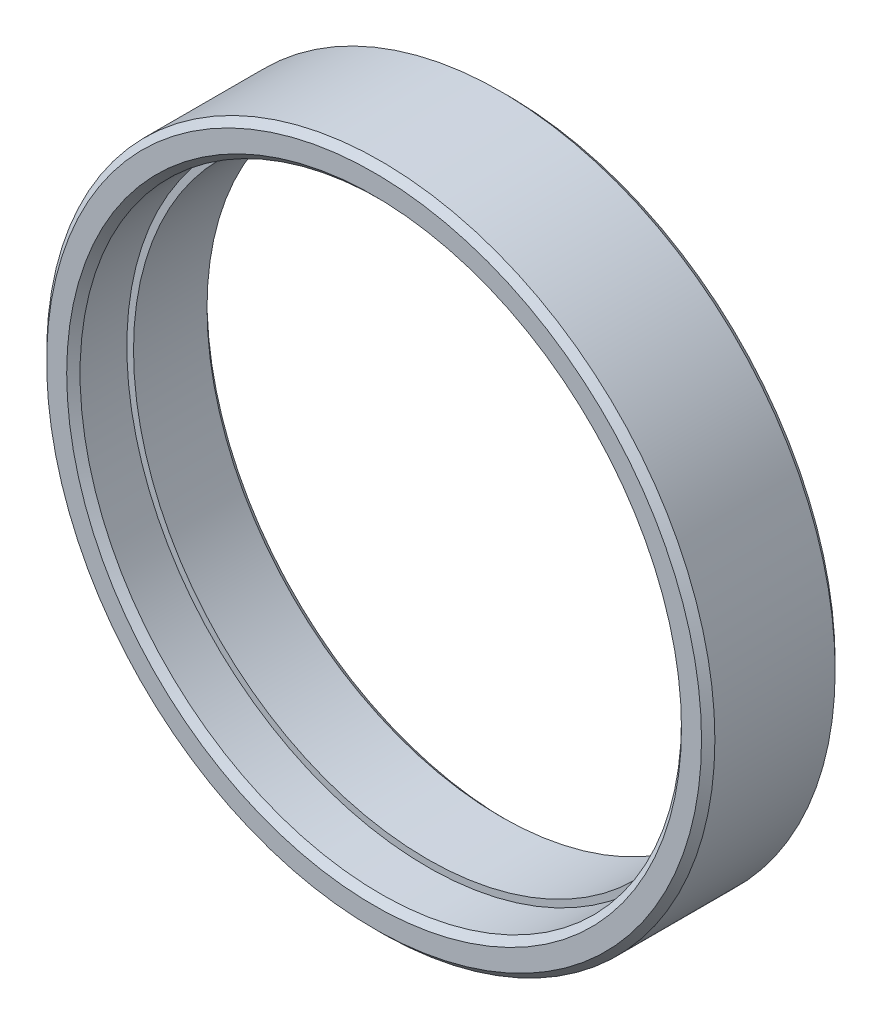
ISO-10303-21;
HEADER;
FILE_DESCRIPTION(('STEP AP214'),'2;1');
FILE_NAME('part.step','',(''),(''),'','','');
FILE_SCHEMA(('AUTOMOTIVE_DESIGN { 1 0 10303 214 1 1 1 1 }'));
ENDSEC;
DATA;
#1=APPLICATION_CONTEXT('core data for automotive mechanical design processes');
#2=APPLICATION_PROTOCOL_DEFINITION('international standard','automotive_design',2000,#1);
#3=PRODUCT_CONTEXT('',#1,'mechanical');
#4=PRODUCT('Part','Part','',(#3));
#5=PRODUCT_RELATED_PRODUCT_CATEGORY('part','',(#4));
#6=PRODUCT_DEFINITION_FORMATION('','',#4);
#7=PRODUCT_DEFINITION_CONTEXT('part definition',#1,'design');
#8=PRODUCT_DEFINITION('design','',#6,#7);
#9=PRODUCT_DEFINITION_SHAPE('','',#8);
#10=(LENGTH_UNIT() NAMED_UNIT(*) SI_UNIT(.MILLI.,.METRE.));
#11=(NAMED_UNIT(*) PLANE_ANGLE_UNIT() SI_UNIT($,.RADIAN.));
#12=(NAMED_UNIT(*) SI_UNIT($,.STERADIAN.) SOLID_ANGLE_UNIT());
#13=UNCERTAINTY_MEASURE_WITH_UNIT(LENGTH_MEASURE(1.E-05),#10,'distance_accuracy_value','');
#14=(GEOMETRIC_REPRESENTATION_CONTEXT(3) GLOBAL_UNCERTAINTY_ASSIGNED_CONTEXT((#13)) GLOBAL_UNIT_ASSIGNED_CONTEXT((#10,
#11,#12)) REPRESENTATION_CONTEXT('',''));
#15=CARTESIAN_POINT('',(0.,0.,0.));
#16=DIRECTION('',(0.,0.,1.));
#17=DIRECTION('',(1.,0.,0.));
#18=AXIS2_PLACEMENT_3D('',#15,#16,#17);
#19=CARTESIAN_POINT('',(0.,0.,10.));
#20=DIRECTION('',(0.,0.,-1.));
#21=DIRECTION('',(-1.,0.,0.));
#22=AXIS2_PLACEMENT_3D('',#19,#20,#21);
#23=CYLINDRICAL_SURFACE('',#22,44.);
#24=CARTESIAN_POINT('',(0.,0.,-9.));
#25=DIRECTION('',(0.,0.,1.));
#26=DIRECTION('',(1.,0.,0.));
#27=AXIS2_PLACEMENT_3D('',#24,#25,#26);
#28=CIRCLE('',#27,44.);
#29=CARTESIAN_POINT('',(44.,0.,-9.));
#30=VERTEX_POINT('',#29);
#31=EDGE_CURVE('E10',#30,#30,#28,.F.);
#32=ORIENTED_EDGE('',*,*,#31,.T.);
#33=EDGE_LOOP('',(#32));
#34=FACE_BOUND('',#33,.T.);
#35=CARTESIAN_POINT('',(0.,0.,2.));
#36=DIRECTION('',(0.,0.,1.));
#37=DIRECTION('',(1.,0.,0.));
#38=AXIS2_PLACEMENT_3D('',#35,#36,#37);
#39=CIRCLE('',#38,44.);
#40=CARTESIAN_POINT('',(44.,0.,2.));
#41=VERTEX_POINT('',#40);
#42=EDGE_CURVE('E65',#41,#41,#39,.T.);
#43=ORIENTED_EDGE('',*,*,#42,.T.);
#44=EDGE_LOOP('',(#43));
#45=FACE_BOUND('',#44,.T.);
#46=ADVANCED_FACE('F32',(#34,#45),#23,.F.);
#47=CARTESIAN_POINT('',(0.,0.,10.));
#48=DIRECTION('',(0.,0.,1.));
#49=DIRECTION('',(1.,0.,0.));
#50=AXIS2_PLACEMENT_3D('',#47,#48,#49);
#51=PLANE('',#50);
#52=CARTESIAN_POINT('',(0.,0.,10.));
#53=DIRECTION('',(0.,0.,1.));
#54=DIRECTION('',(1.,0.,0.));
#55=AXIS2_PLACEMENT_3D('',#52,#53,#54);
#56=CIRCLE('',#55,46.);
#57=CARTESIAN_POINT('',(46.,0.,10.));
#58=VERTEX_POINT('',#57);
#59=EDGE_CURVE('E56',#58,#58,#56,.F.);
#60=ORIENTED_EDGE('',*,*,#59,.T.);
#61=EDGE_LOOP('',(#60));
#62=FACE_BOUND('',#61,.T.);
#63=CARTESIAN_POINT('',(0.,0.,10.));
#64=DIRECTION('',(0.,0.,1.));
#65=DIRECTION('',(1.,0.,0.));
#66=AXIS2_PLACEMENT_3D('',#63,#64,#65);
#67=CIRCLE('',#66,49.);
#68=CARTESIAN_POINT('',(49.,0.,10.));
#69=VERTEX_POINT('',#68);
#70=EDGE_CURVE('E59',#69,#69,#67,.T.);
#71=ORIENTED_EDGE('',*,*,#70,.T.);
#72=EDGE_LOOP('',(#71));
#73=FACE_BOUND('',#72,.T.);
#74=ADVANCED_FACE('F91',(#62,#73),#51,.T.);
#75=CARTESIAN_POINT('',(0.,0.,-10.));
#76=DIRECTION('',(0.,0.,1.));
#77=DIRECTION('',(1.,0.,0.));
#78=AXIS2_PLACEMENT_3D('',#75,#76,#77);
#79=PLANE('',#78);
#80=CARTESIAN_POINT('',(0.,0.,-10.));
#81=DIRECTION('',(0.,0.,1.));
#82=DIRECTION('',(1.,0.,0.));
#83=AXIS2_PLACEMENT_3D('',#80,#81,#82);
#84=CIRCLE('',#83,45.);
#85=CARTESIAN_POINT('',(45.,0.,-10.));
#86=VERTEX_POINT('',#85);
#87=EDGE_CURVE('E40',#86,#86,#84,.T.);
#88=ORIENTED_EDGE('',*,*,#87,.T.);
#89=EDGE_LOOP('',(#88));
#90=FACE_BOUND('',#89,.T.);
#91=CARTESIAN_POINT('',(0.,0.,-10.));
#92=DIRECTION('',(0.,0.,1.));
#93=DIRECTION('',(1.,0.,0.));
#94=AXIS2_PLACEMENT_3D('',#91,#92,#93);
#95=CIRCLE('',#94,49.);
#96=CARTESIAN_POINT('',(49.,0.,-10.));
#97=VERTEX_POINT('',#96);
#98=EDGE_CURVE('E44',#97,#97,#95,.F.);
#99=ORIENTED_EDGE('',*,*,#98,.T.);
#100=EDGE_LOOP('',(#99));
#101=FACE_BOUND('',#100,.T.);
#102=ADVANCED_FACE('F86',(#90,#101),#79,.F.);
#103=CARTESIAN_POINT('',(0.,0.,10.));
#104=DIRECTION('',(0.,0.,-1.));
#105=DIRECTION('',(-1.,0.,0.));
#106=AXIS2_PLACEMENT_3D('',#103,#104,#105);
#107=CYLINDRICAL_SURFACE('',#106,50.);
#108=CARTESIAN_POINT('',(0.,0.,9.00000000000001));
#109=DIRECTION('',(0.,0.,1.));
#110=DIRECTION('',(1.,0.,0.));
#111=AXIS2_PLACEMENT_3D('',#108,#109,#110);
#112=CIRCLE('',#111,50.);
#113=CARTESIAN_POINT('',(50.,0.,9.00000000000001));
#114=VERTEX_POINT('',#113);
#115=EDGE_CURVE('E48',#114,#114,#112,.F.);
#116=ORIENTED_EDGE('',*,*,#115,.T.);
#117=EDGE_LOOP('',(#116));
#118=FACE_BOUND('',#117,.T.);
#119=CARTESIAN_POINT('',(0.,0.,-9.00000000000001));
#120=DIRECTION('',(0.,0.,1.));
#121=DIRECTION('',(1.,0.,0.));
#122=AXIS2_PLACEMENT_3D('',#119,#120,#121);
#123=CIRCLE('',#122,50.);
#124=CARTESIAN_POINT('',(50.,0.,-9.00000000000001));
#125=VERTEX_POINT('',#124);
#126=EDGE_CURVE('E53',#125,#125,#123,.T.);
#127=ORIENTED_EDGE('',*,*,#126,.T.);
#128=EDGE_LOOP('',(#127));
#129=FACE_BOUND('',#128,.T.);
#130=ADVANCED_FACE('F76',(#118,#129),#107,.T.);
#131=CARTESIAN_POINT('',(0.,0.,2.));
#132=DIRECTION('',(0.,0.,1.));
#133=DIRECTION('',(1.,0.,0.));
#134=AXIS2_PLACEMENT_3D('',#131,#132,#133);
#135=CYLINDRICAL_SURFACE('',#134,45.);
#136=CARTESIAN_POINT('',(0.,0.,9.));
#137=DIRECTION('',(0.,0.,1.));
#138=DIRECTION('',(1.,0.,0.));
#139=AXIS2_PLACEMENT_3D('',#136,#137,#138);
#140=CIRCLE('',#139,45.);
#141=CARTESIAN_POINT('',(45.,0.,9.));
#142=VERTEX_POINT('',#141);
#143=EDGE_CURVE('E62',#142,#142,#140,.T.);
#144=ORIENTED_EDGE('',*,*,#143,.T.);
#145=EDGE_LOOP('',(#144));
#146=FACE_BOUND('',#145,.T.);
#147=CARTESIAN_POINT('',(0.,0.,2.));
#148=DIRECTION('',(0.,0.,1.));
#149=DIRECTION('',(1.,0.,0.));
#150=AXIS2_PLACEMENT_3D('',#147,#148,#149);
#151=CIRCLE('',#150,45.);
#152=CARTESIAN_POINT('',(45.,0.,2.));
#153=VERTEX_POINT('',#152);
#154=EDGE_CURVE('E68',#153,#153,#151,.T.);
#155=ORIENTED_EDGE('',*,*,#154,.F.);
#156=EDGE_LOOP('',(#155));
#157=FACE_BOUND('',#156,.T.);
#158=ADVANCED_FACE('F74',(#146,#157),#135,.F.);
#159=CARTESIAN_POINT('',(0.,0.,2.));
#160=DIRECTION('',(0.,0.,1.));
#161=DIRECTION('',(1.,0.,0.));
#162=AXIS2_PLACEMENT_3D('',#159,#160,#161);
#163=PLANE('',#162);
#164=ORIENTED_EDGE('',*,*,#42,.F.);
#165=EDGE_LOOP('',(#164));
#166=FACE_BOUND('',#165,.T.);
#167=ORIENTED_EDGE('',*,*,#154,.T.);
#168=EDGE_LOOP('',(#167));
#169=FACE_BOUND('',#168,.T.);
#170=ADVANCED_FACE('F72',(#166,#169),#163,.T.);
#171=CARTESIAN_POINT('',(0.,0.,9.));
#172=DIRECTION('',(0.,0.,1.));
#173=DIRECTION('',(1.,0.,0.));
#174=AXIS2_PLACEMENT_3D('',#171,#172,#173);
#175=CONICAL_SURFACE('',#174,45.,0.785398163397448);
#176=ORIENTED_EDGE('',*,*,#59,.F.);
#177=EDGE_LOOP('',(#176));
#178=FACE_BOUND('',#177,.T.);
#179=ORIENTED_EDGE('',*,*,#143,.F.);
#180=EDGE_LOOP('',(#179));
#181=FACE_BOUND('',#180,.T.);
#182=ADVANCED_FACE('F83',(#178,#181),#175,.F.);
#183=CARTESIAN_POINT('',(0.,0.,10.));
#184=DIRECTION('',(0.,0.,-1.));
#185=DIRECTION('',(-1.,0.,0.));
#186=AXIS2_PLACEMENT_3D('',#183,#184,#185);
#187=CONICAL_SURFACE('',#186,49.,0.785398163397438);
#188=ORIENTED_EDGE('',*,*,#115,.F.);
#189=EDGE_LOOP('',(#188));
#190=FACE_BOUND('',#189,.T.);
#191=ORIENTED_EDGE('',*,*,#70,.F.);
#192=EDGE_LOOP('',(#191));
#193=FACE_BOUND('',#192,.T.);
#194=ADVANCED_FACE('F107',(#190,#193),#187,.T.);
#195=CARTESIAN_POINT('',(0.,0.,-10.));
#196=DIRECTION('',(0.,0.,-1.));
#197=DIRECTION('',(-1.,0.,0.));
#198=AXIS2_PLACEMENT_3D('',#195,#196,#197);
#199=CONICAL_SURFACE('',#198,45.,0.785398163397445);
#200=ORIENTED_EDGE('',*,*,#31,.F.);
#201=EDGE_LOOP('',(#200));
#202=FACE_BOUND('',#201,.T.);
#203=ORIENTED_EDGE('',*,*,#87,.F.);
#204=EDGE_LOOP('',(#203));
#205=FACE_BOUND('',#204,.T.);
#206=ADVANCED_FACE('F113',(#202,#205),#199,.F.);
#207=CARTESIAN_POINT('',(0.,0.,-9.00000000000001));
#208=DIRECTION('',(0.,0.,1.));
#209=DIRECTION('',(1.,0.,0.));
#210=AXIS2_PLACEMENT_3D('',#207,#208,#209);
#211=CONICAL_SURFACE('',#210,50.,0.785398163397452);
#212=ORIENTED_EDGE('',*,*,#98,.F.);
#213=EDGE_LOOP('',(#212));
#214=FACE_BOUND('',#213,.T.);
#215=ORIENTED_EDGE('',*,*,#126,.F.);
#216=EDGE_LOOP('',(#215));
#217=FACE_BOUND('',#216,.T.);
#218=ADVANCED_FACE('F35',(#214,#217),#211,.T.);
#219=CLOSED_SHELL('',(#46,#74,#102,#130,#158,#170,#182,#194,#206,#218));
#220=MANIFOLD_SOLID_BREP('B2',#219);
#221=ADVANCED_BREP_SHAPE_REPRESENTATION('',(#18,#220),#14);
#222=SHAPE_DEFINITION_REPRESENTATION(#9,#221);
ENDSEC;
END-ISO-10303-21;
